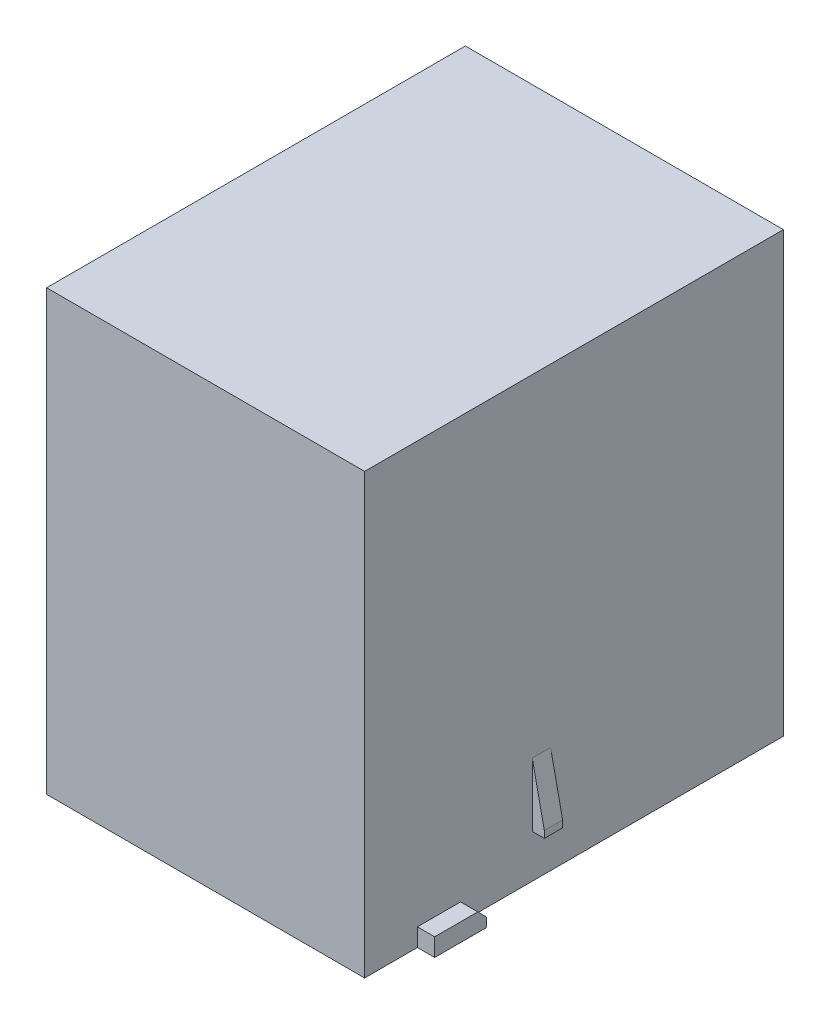
ISO-10303-21;
HEADER;
FILE_DESCRIPTION(('STEP AP214'),'2;1');
FILE_NAME('part.step','',(''),(''),'','','');
FILE_SCHEMA(('AUTOMOTIVE_DESIGN { 1 0 10303 214 1 1 1 1 }'));
ENDSEC;
DATA;
#1=APPLICATION_CONTEXT('core data for automotive mechanical design processes');
#2=APPLICATION_PROTOCOL_DEFINITION('international standard','automotive_design',2000,#1);
#3=PRODUCT_CONTEXT('',#1,'mechanical');
#4=PRODUCT('Part','Part','',(#3));
#5=PRODUCT_RELATED_PRODUCT_CATEGORY('part','',(#4));
#6=PRODUCT_DEFINITION_FORMATION('','',#4);
#7=PRODUCT_DEFINITION_CONTEXT('part definition',#1,'design');
#8=PRODUCT_DEFINITION('design','',#6,#7);
#9=PRODUCT_DEFINITION_SHAPE('','',#8);
#10=(LENGTH_UNIT() NAMED_UNIT(*) SI_UNIT(.MILLI.,.METRE.));
#11=(NAMED_UNIT(*) PLANE_ANGLE_UNIT() SI_UNIT($,.RADIAN.));
#12=(NAMED_UNIT(*) SI_UNIT($,.STERADIAN.) SOLID_ANGLE_UNIT());
#13=UNCERTAINTY_MEASURE_WITH_UNIT(LENGTH_MEASURE(1.E-05),#10,'distance_accuracy_value','');
#14=(GEOMETRIC_REPRESENTATION_CONTEXT(3) GLOBAL_UNCERTAINTY_ASSIGNED_CONTEXT((#13)) GLOBAL_UNIT_ASSIGNED_CONTEXT((#10,
#11,#12)) REPRESENTATION_CONTEXT('',''));
#15=CARTESIAN_POINT('',(0.,0.,0.));
#16=DIRECTION('',(0.,0.,1.));
#17=DIRECTION('',(1.,0.,0.));
#18=AXIS2_PLACEMENT_3D('',#15,#16,#17);
#19=CARTESIAN_POINT('',(-1.0716,0.0906,-6.64));
#20=DIRECTION('',(0.,0.,-1.));
#21=DIRECTION('',(-1.,0.,0.));
#22=AXIS2_PLACEMENT_3D('',#19,#20,#21);
#23=PLANE('',#22);
#24=DIRECTION('',(0.,1.,0.));
#25=VECTOR('',#24,1.);
#26=CARTESIAN_POINT('',(-10.84,0.345,-6.64));
#27=LINE('',#26,#25);
#28=CARTESIAN_POINT('',(-10.84,1.59499999999997,-6.64));
#29=VERTEX_POINT('',#28);
#30=CARTESIAN_POINT('',(-10.84,3.435,-6.64));
#31=VERTEX_POINT('',#30);
#32=EDGE_CURVE('E11',#29,#31,#27,.T.);
#33=ORIENTED_EDGE('',*,*,#32,.F.);
#34=DIRECTION('',(-1.,0.,0.));
#35=VECTOR('',#34,1.);
#36=CARTESIAN_POINT('',(-6.23,1.595,-6.64));
#37=LINE('',#36,#35);
#38=CARTESIAN_POINT('',(-11.1899999999979,1.59499999999995,-6.64000000000016));
#39=VERTEX_POINT('',#38);
#40=EDGE_CURVE('E211',#29,#39,#37,.T.);
#41=ORIENTED_EDGE('',*,*,#40,.T.);
#42=DIRECTION('',(0.,1.,0.));
#43=VECTOR('',#42,1.);
#44=CARTESIAN_POINT('',(-11.19,6.705,-6.64));
#45=LINE('',#44,#43);
#46=CARTESIAN_POINT('',(-11.19,1.795,-6.64));
#47=VERTEX_POINT('',#46);
#48=EDGE_CURVE('E207',#39,#47,#45,.T.);
#49=ORIENTED_EDGE('',*,*,#48,.T.);
#50=DIRECTION('',(0.208714520349179,0.977976609636147,0.));
#51=VECTOR('',#50,1.);
#52=CARTESIAN_POINT('',(-11.19,1.795,-6.64));
#53=LINE('',#52,#51);
#54=EDGE_CURVE('E210',#47,#31,#53,.T.);
#55=ORIENTED_EDGE('',*,*,#54,.T.);
#56=EDGE_LOOP('',(#33,#41,#49,#55));
#57=FACE_BOUND('',#56,.T.);
#58=ADVANCED_FACE('F35',(#57),#23,.T.);
#59=CARTESIAN_POINT('',(-0.9156,0.865,-2.755));
#60=DIRECTION('',(0.,-1.,0.));
#61=DIRECTION('',(-1.,0.,0.));
#62=AXIS2_PLACEMENT_3D('',#59,#60,#61);
#63=PLANE('',#62);
#64=DIRECTION('',(0.,0.,1.));
#65=VECTOR('',#64,1.);
#66=CARTESIAN_POINT('',(-1.12,0.864999999999999,-3.53));
#67=LINE('',#66,#65);
#68=CARTESIAN_POINT('',(-1.12,0.865000000000001,-4.03000000000018));
#69=VERTEX_POINT('',#68);
#70=CARTESIAN_POINT('',(-1.11999999999995,0.865,-2.78));
#71=VERTEX_POINT('',#70);
#72=EDGE_CURVE('E125',#69,#71,#67,.T.);
#73=ORIENTED_EDGE('',*,*,#72,.F.);
#74=DIRECTION('',(1.,0.,0.));
#75=VECTOR('',#74,1.);
#76=CARTESIAN_POINT('',(-1.37,0.865000000000006,-4.03000000000035));
#77=LINE('',#76,#75);
#78=CARTESIAN_POINT('',(-1.62,0.865000000000001,-4.03000000000018));
#79=VERTEX_POINT('',#78);
#80=EDGE_CURVE('E174',#79,#69,#77,.T.);
#81=ORIENTED_EDGE('',*,*,#80,.F.);
#82=DIRECTION('',(0.,0.,-1.));
#83=VECTOR('',#82,1.);
#84=CARTESIAN_POINT('',(-1.62,0.865,-3.945));
#85=LINE('',#84,#83);
#86=CARTESIAN_POINT('',(-1.62000000000009,0.865,-2.78));
#87=VERTEX_POINT('',#86);
#88=EDGE_CURVE('E142',#87,#79,#85,.T.);
#89=ORIENTED_EDGE('',*,*,#88,.F.);
#90=DIRECTION('',(-1.,0.,0.));
#91=VECTOR('',#90,1.);
#92=CARTESIAN_POINT('',(-1.37,0.864999999999999,-2.78));
#93=LINE('',#92,#91);
#94=EDGE_CURVE('E139',#71,#87,#93,.T.);
#95=ORIENTED_EDGE('',*,*,#94,.F.);
#96=EDGE_LOOP('',(#73,#81,#89,#95));
#97=FACE_BOUND('',#96,.T.);
#98=ADVANCED_FACE('F140',(#97),#63,.F.);
#99=CARTESIAN_POINT('',(-1.640665567885,0.8796127631884,-4.015387236812));
#100=DIRECTION('',(0.,0.707106781185535,-0.70710678118756));
#101=DIRECTION('',(1.,0.,0.));
#102=AXIS2_PLACEMENT_3D('',#99,#100,#101);
#103=PLANE('',#102);
#104=DIRECTION('',(1.,0.,0.));
#105=VECTOR('',#104,1.);
#106=CARTESIAN_POINT('',(-1.37,0.614999999999998,-4.28));
#107=LINE('',#106,#105);
#108=CARTESIAN_POINT('',(-1.62,0.615,-4.28));
#109=VERTEX_POINT('',#108);
#110=CARTESIAN_POINT('',(-1.12,0.614999999999992,-4.28));
#111=VERTEX_POINT('',#110);
#112=EDGE_CURVE('E156',#109,#111,#107,.T.);
#113=ORIENTED_EDGE('',*,*,#112,.F.);
#114=DIRECTION('',(0.,-0.707106781186548,-0.707106781186547));
#115=VECTOR('',#114,1.);
#116=CARTESIAN_POINT('',(-1.62,0.865,-4.03));
#117=LINE('',#116,#115);
#118=EDGE_CURVE('E178',#79,#109,#117,.T.);
#119=ORIENTED_EDGE('',*,*,#118,.F.);
#120=ORIENTED_EDGE('',*,*,#80,.T.);
#121=DIRECTION('',(0.,0.707106781186568,0.707106781186527));
#122=VECTOR('',#121,1.);
#123=CARTESIAN_POINT('',(-1.12,0.614999999999986,-4.28));
#124=LINE('',#123,#122);
#125=EDGE_CURVE('E135',#111,#69,#124,.T.);
#126=ORIENTED_EDGE('',*,*,#125,.F.);
#127=EDGE_LOOP('',(#113,#119,#120,#126));
#128=FACE_BOUND('',#127,.T.);
#129=ADVANCED_FACE('F232',(#128),#103,.T.);
#130=CARTESIAN_POINT('',(-1.640665567885,3.4718,-6.11));
#131=DIRECTION('',(0.,0.,-1.));
#132=DIRECTION('',(1.,0.,0.));
#133=AXIS2_PLACEMENT_3D('',#130,#131,#132);
#134=PLANE('',#133);
#135=DIRECTION('',(-1.,0.,0.));
#136=VECTOR('',#135,1.);
#137=CARTESIAN_POINT('',(-1.445,1.595,-6.11));
#138=LINE('',#137,#136);
#139=CARTESIAN_POINT('',(-1.26999999999986,1.59499999999996,-6.10999999999991));
#140=VERTEX_POINT('',#139);
#141=CARTESIAN_POINT('',(-1.62000000000015,1.595,-6.10999999999995));
#142=VERTEX_POINT('',#141);
#143=EDGE_CURVE('E104',#140,#142,#138,.T.);
#144=ORIENTED_EDGE('',*,*,#143,.F.);
#145=DIRECTION('',(0.,-1.,0.));
#146=VECTOR('',#145,1.);
#147=CARTESIAN_POINT('',(-1.26999999999982,2.515,-6.11));
#148=LINE('',#147,#146);
#149=CARTESIAN_POINT('',(-1.26999999999992,1.79499999999968,-6.11));
#150=VERTEX_POINT('',#149);
#151=EDGE_CURVE('E157',#150,#140,#148,.T.);
#152=ORIENTED_EDGE('',*,*,#151,.F.);
#153=DIRECTION('',(0.208714520349178,-0.977976609636147,0.));
#154=VECTOR('',#153,1.);
#155=CARTESIAN_POINT('',(-1.627,3.4678,-6.11));
#156=LINE('',#155,#154);
#157=CARTESIAN_POINT('',(-1.62,3.435,-6.11));
#158=VERTEX_POINT('',#157);
#159=EDGE_CURVE('E39',#158,#150,#156,.T.);
#160=ORIENTED_EDGE('',*,*,#159,.F.);
#161=DIRECTION('',(0.,1.,0.));
#162=VECTOR('',#161,1.);
#163=CARTESIAN_POINT('',(-1.62,6.705,-6.11));
#164=LINE('',#163,#162);
#165=EDGE_CURVE('E158',#142,#158,#164,.T.);
#166=ORIENTED_EDGE('',*,*,#165,.F.);
#167=EDGE_LOOP('',(#144,#152,#160,#166));
#168=FACE_BOUND('',#167,.T.);
#169=ADVANCED_FACE('F484',(#168),#134,.F.);
#170=CARTESIAN_POINT('',(-11.34,0.8856655678848,-2.75));
#171=DIRECTION('',(-1.,0.,0.));
#172=DIRECTION('',(0.,0.,-1.));
#173=AXIS2_PLACEMENT_3D('',#170,#171,#172);
#174=PLANE('',#173);
#175=DIRECTION('',(0.,0.70710678118756,0.707106781185535));
#176=VECTOR('',#175,1.);
#177=CARTESIAN_POINT('',(-11.3399999999956,0.74,-4.155));
#178=LINE('',#177,#176);
#179=CARTESIAN_POINT('',(-11.3399999999967,0.614999999999982,-4.27999999999992));
#180=VERTEX_POINT('',#179);
#181=CARTESIAN_POINT('',(-11.3399999999989,0.865000000000001,-4.03000000000009));
#182=VERTEX_POINT('',#181);
#183=EDGE_CURVE('E185',#180,#182,#178,.T.);
#184=ORIENTED_EDGE('',*,*,#183,.F.);
#185=DIRECTION('',(0.,1.,0.));
#186=VECTOR('',#185,1.);
#187=CARTESIAN_POINT('',(-11.3399999999956,0.48,-4.28));
#188=LINE('',#187,#186);
#189=CARTESIAN_POINT('',(-11.3399999999989,0.344999999999979,-4.28));
#190=VERTEX_POINT('',#189);
#191=EDGE_CURVE('E146',#190,#180,#188,.T.);
#192=ORIENTED_EDGE('',*,*,#191,.F.);
#193=DIRECTION('',(0.,0.,-1.));
#194=VECTOR('',#193,1.);
#195=CARTESIAN_POINT('',(-11.34,0.345,-3.945));
#196=LINE('',#195,#194);
#197=CARTESIAN_POINT('',(-11.3399999999978,0.344999999999978,-2.78));
#198=VERTEX_POINT('',#197);
#199=EDGE_CURVE('E256',#198,#190,#196,.T.);
#200=ORIENTED_EDGE('',*,*,#199,.F.);
#201=DIRECTION('',(0.,-1.,0.));
#202=VECTOR('',#201,1.);
#203=CARTESIAN_POINT('',(-11.3399999999956,0.605,-2.78));
#204=LINE('',#203,#202);
#205=CARTESIAN_POINT('',(-11.3399999999989,0.865,-2.78));
#206=VERTEX_POINT('',#205);
#207=EDGE_CURVE('E274',#206,#198,#204,.T.);
#208=ORIENTED_EDGE('',*,*,#207,.F.);
#209=DIRECTION('',(0.,0.,-1.));
#210=VECTOR('',#209,1.);
#211=CARTESIAN_POINT('',(-11.34,0.865,-3.405));
#212=LINE('',#211,#210);
#213=EDGE_CURVE('E194',#206,#182,#212,.T.);
#214=ORIENTED_EDGE('',*,*,#213,.T.);
#215=EDGE_LOOP('',(#184,#192,#200,#208,#214));
#216=FACE_BOUND('',#215,.T.);
#217=ADVANCED_FACE('F290',(#216),#174,.T.);
#218=CARTESIAN_POINT('',(-1.640665567885,0.6356655678848,-4.28));
#219=DIRECTION('',(0.,0.,-1.));
#220=DIRECTION('',(1.,0.,0.));
#221=AXIS2_PLACEMENT_3D('',#218,#219,#220);
#222=PLANE('',#221);
#223=ORIENTED_EDGE('',*,*,#112,.T.);
#224=DIRECTION('',(0.,1.,0.));
#225=VECTOR('',#224,1.);
#226=CARTESIAN_POINT('',(-1.12,0.605,-4.28));
#227=LINE('',#226,#225);
#228=CARTESIAN_POINT('',(-1.11999999999991,0.344999999999979,-4.28));
#229=VERTEX_POINT('',#228);
#230=EDGE_CURVE('E172',#229,#111,#227,.T.);
#231=ORIENTED_EDGE('',*,*,#230,.F.);
#232=DIRECTION('',(1.,0.,0.));
#233=VECTOR('',#232,1.);
#234=CARTESIAN_POINT('',(-6.23,0.345,-4.28));
#235=LINE('',#234,#233);
#236=CARTESIAN_POINT('',(-1.62000000000005,0.344999999999993,-4.28));
#237=VERTEX_POINT('',#236);
#238=EDGE_CURVE('E237',#237,#229,#235,.T.);
#239=ORIENTED_EDGE('',*,*,#238,.F.);
#240=DIRECTION('',(0.,-1.,0.));
#241=VECTOR('',#240,1.);
#242=CARTESIAN_POINT('',(-1.62,6.705,-4.28));
#243=LINE('',#242,#241);
#244=EDGE_CURVE('E161',#109,#237,#243,.T.);
#245=ORIENTED_EDGE('',*,*,#244,.F.);
#246=EDGE_LOOP('',(#223,#231,#239,#245));
#247=FACE_BOUND('',#246,.T.);
#248=ADVANCED_FACE('F235',(#247),#222,.T.);
#249=CARTESIAN_POINT('',(-1.12,0.8856655678848,-4.31));
#250=DIRECTION('',(1.,0.,0.));
#251=DIRECTION('',(0.,0.,1.));
#252=AXIS2_PLACEMENT_3D('',#249,#250,#251);
#253=PLANE('',#252);
#254=ORIENTED_EDGE('',*,*,#72,.T.);
#255=DIRECTION('',(0.,1.,0.));
#256=VECTOR('',#255,1.);
#257=CARTESIAN_POINT('',(-1.11999999999979,0.605,-2.78));
#258=LINE('',#257,#256);
#259=CARTESIAN_POINT('',(-1.11999999999995,0.344999999999978,-2.78));
#260=VERTEX_POINT('',#259);
#261=EDGE_CURVE('E131',#260,#71,#258,.T.);
#262=ORIENTED_EDGE('',*,*,#261,.F.);
#263=DIRECTION('',(0.,0.,1.));
#264=VECTOR('',#263,1.);
#265=CARTESIAN_POINT('',(-1.12,0.345,-3.945));
#266=LINE('',#265,#264);
#267=EDGE_CURVE('E243',#229,#260,#266,.T.);
#268=ORIENTED_EDGE('',*,*,#267,.F.);
#269=ORIENTED_EDGE('',*,*,#230,.T.);
#270=ORIENTED_EDGE('',*,*,#125,.T.);
#271=EDGE_LOOP('',(#254,#262,#268,#269,#270));
#272=FACE_BOUND('',#271,.T.);
#273=ADVANCED_FACE('F127',(#272),#253,.T.);
#274=CARTESIAN_POINT('',(-1.099334432115,0.8856655678848,-2.78));
#275=DIRECTION('',(0.,0.,1.));
#276=DIRECTION('',(-1.,0.,0.));
#277=AXIS2_PLACEMENT_3D('',#274,#275,#276);
#278=PLANE('',#277);
#279=ORIENTED_EDGE('',*,*,#94,.T.);
#280=DIRECTION('',(0.,1.,0.));
#281=VECTOR('',#280,1.);
#282=CARTESIAN_POINT('',(-1.62,6.705,-2.78));
#283=LINE('',#282,#281);
#284=CARTESIAN_POINT('',(-1.62000000000009,0.344999999999986,-2.78));
#285=VERTEX_POINT('',#284);
#286=EDGE_CURVE('E179',#285,#87,#283,.T.);
#287=ORIENTED_EDGE('',*,*,#286,.F.);
#288=DIRECTION('',(-1.,0.,0.));
#289=VECTOR('',#288,1.);
#290=CARTESIAN_POINT('',(-6.23,0.345,-2.78));
#291=LINE('',#290,#289);
#292=EDGE_CURVE('E150',#260,#285,#291,.T.);
#293=ORIENTED_EDGE('',*,*,#292,.F.);
#294=ORIENTED_EDGE('',*,*,#261,.T.);
#295=EDGE_LOOP('',(#279,#287,#293,#294));
#296=FACE_BOUND('',#295,.T.);
#297=ADVANCED_FACE('F148',(#296),#278,.T.);
#298=CARTESIAN_POINT('',(-11.21066556788,3.4718,-6.11));
#299=DIRECTION('',(0.,0.,-1.));
#300=DIRECTION('',(1.,0.,0.));
#301=AXIS2_PLACEMENT_3D('',#298,#299,#300);
#302=PLANE('',#301);
#303=DIRECTION('',(0.208714520349178,0.977976609636147,0.));
#304=VECTOR('',#303,1.);
#305=CARTESIAN_POINT('',(-11.015,2.615,-6.10999999999982));
#306=LINE('',#305,#304);
#307=CARTESIAN_POINT('',(-11.1899999999979,1.79500000000004,-6.10999999999991));
#308=VERTEX_POINT('',#307);
#309=CARTESIAN_POINT('',(-10.8400000000011,3.43499999999976,-6.10999999999991));
#310=VERTEX_POINT('',#309);
#311=EDGE_CURVE('E206',#308,#310,#306,.T.);
#312=ORIENTED_EDGE('',*,*,#311,.F.);
#313=DIRECTION('',(0.,1.,0.));
#314=VECTOR('',#313,1.);
#315=CARTESIAN_POINT('',(-11.19,1.695,-6.10999999999982));
#316=LINE('',#315,#314);
#317=CARTESIAN_POINT('',(-11.1899999999968,1.59499999999995,-6.10999999999991));
#318=VERTEX_POINT('',#317);
#319=EDGE_CURVE('E349',#318,#308,#316,.T.);
#320=ORIENTED_EDGE('',*,*,#319,.F.);
#321=DIRECTION('',(-1.,0.,0.));
#322=VECTOR('',#321,1.);
#323=CARTESIAN_POINT('',(-11.015,1.595,-6.10999999999982));
#324=LINE('',#323,#322);
#325=CARTESIAN_POINT('',(-10.8400000000032,1.595,-6.10999999999995));
#326=VERTEX_POINT('',#325);
#327=EDGE_CURVE('E351',#326,#318,#324,.T.);
#328=ORIENTED_EDGE('',*,*,#327,.F.);
#329=DIRECTION('',(0.,-1.,0.));
#330=VECTOR('',#329,1.);
#331=CARTESIAN_POINT('',(-10.84,6.705,-6.11));
#332=LINE('',#331,#330);
#333=EDGE_CURVE('E214',#310,#326,#332,.T.);
#334=ORIENTED_EDGE('',*,*,#333,.F.);
#335=EDGE_LOOP('',(#312,#320,#328,#334));
#336=FACE_BOUND('',#335,.T.);
#337=ADVANCED_FACE('F472',(#336),#302,.F.);
#338=CARTESIAN_POINT('',(-11.36066556788,0.6356655678848,-4.28));
#339=DIRECTION('',(0.,0.,-1.));
#340=DIRECTION('',(1.,0.,0.));
#341=AXIS2_PLACEMENT_3D('',#338,#339,#340);
#342=PLANE('',#341);
#343=DIRECTION('',(-1.,0.,0.));
#344=VECTOR('',#343,1.);
#345=CARTESIAN_POINT('',(-11.09,0.614999999999945,-4.2799999999997));
#346=LINE('',#345,#344);
#347=CARTESIAN_POINT('',(-10.84,0.615000000000017,-4.27999999999989));
#348=VERTEX_POINT('',#347);
#349=EDGE_CURVE('E182',#348,#180,#346,.T.);
#350=ORIENTED_EDGE('',*,*,#349,.F.);
#351=DIRECTION('',(0.,1.,0.));
#352=VECTOR('',#351,1.);
#353=CARTESIAN_POINT('',(-10.84,6.705,-4.28));
#354=LINE('',#353,#352);
#355=CARTESIAN_POINT('',(-10.8400000000011,0.344999999999993,-4.28));
#356=VERTEX_POINT('',#355);
#357=EDGE_CURVE('E186',#356,#348,#354,.T.);
#358=ORIENTED_EDGE('',*,*,#357,.F.);
#359=DIRECTION('',(1.,0.,0.));
#360=VECTOR('',#359,1.);
#361=CARTESIAN_POINT('',(-6.23,0.345,-4.28));
#362=LINE('',#361,#360);
#363=EDGE_CURVE('E253',#190,#356,#362,.T.);
#364=ORIENTED_EDGE('',*,*,#363,.F.);
#365=ORIENTED_EDGE('',*,*,#191,.T.);
#366=EDGE_LOOP('',(#350,#358,#364,#365));
#367=FACE_BOUND('',#366,.T.);
#368=ADVANCED_FACE('F285',(#367),#342,.T.);
#369=CARTESIAN_POINT('',(-11.36066556788,0.8796127631884,-4.015387236812));
#370=DIRECTION('',(0.,0.707106781185535,-0.70710678118756));
#371=DIRECTION('',(1.,0.,0.));
#372=AXIS2_PLACEMENT_3D('',#369,#370,#371);
#373=PLANE('',#372);
#374=ORIENTED_EDGE('',*,*,#349,.T.);
#375=ORIENTED_EDGE('',*,*,#183,.T.);
#376=DIRECTION('',(1.,0.,0.));
#377=VECTOR('',#376,1.);
#378=CARTESIAN_POINT('',(-6.23,0.865,-4.03));
#379=LINE('',#378,#377);
#380=CARTESIAN_POINT('',(-10.84,0.865,-4.03));
#381=VERTEX_POINT('',#380);
#382=EDGE_CURVE('E191',#182,#381,#379,.T.);
#383=ORIENTED_EDGE('',*,*,#382,.T.);
#384=DIRECTION('',(0.,0.707106781186548,0.707106781186547));
#385=VECTOR('',#384,1.);
#386=CARTESIAN_POINT('',(-10.84,0.615,-4.28));
#387=LINE('',#386,#385);
#388=EDGE_CURVE('E189',#348,#381,#387,.T.);
#389=ORIENTED_EDGE('',*,*,#388,.F.);
#390=EDGE_LOOP('',(#374,#375,#383,#389));
#391=FACE_BOUND('',#390,.T.);
#392=ADVANCED_FACE('F294',(#391),#373,.T.);
#393=CARTESIAN_POINT('',(-0.9156,0.865,-2.755));
#394=DIRECTION('',(0.,-1.,0.));
#395=DIRECTION('',(-1.,0.,0.));
#396=AXIS2_PLACEMENT_3D('',#393,#394,#395);
#397=PLANE('',#396);
#398=ORIENTED_EDGE('',*,*,#213,.F.);
#399=DIRECTION('',(-1.,0.,0.));
#400=VECTOR('',#399,1.);
#401=CARTESIAN_POINT('',(-11.09,0.864999999999999,-2.78));
#402=LINE('',#401,#400);
#403=CARTESIAN_POINT('',(-10.8400000000011,0.865,-2.78));
#404=VERTEX_POINT('',#403);
#405=EDGE_CURVE('E193',#404,#206,#402,.T.);
#406=ORIENTED_EDGE('',*,*,#405,.F.);
#407=DIRECTION('',(0.,0.,1.));
#408=VECTOR('',#407,1.);
#409=CARTESIAN_POINT('',(-10.84,0.865,-3.945));
#410=LINE('',#409,#408);
#411=EDGE_CURVE('E195',#381,#404,#410,.T.);
#412=ORIENTED_EDGE('',*,*,#411,.F.);
#413=ORIENTED_EDGE('',*,*,#382,.F.);
#414=EDGE_LOOP('',(#398,#406,#412,#413));
#415=FACE_BOUND('',#414,.T.);
#416=ADVANCED_FACE('F464',(#415),#397,.F.);
#417=CARTESIAN_POINT('',(-10.81933443212,0.8856655678848,-2.78));
#418=DIRECTION('',(0.,0.,1.));
#419=DIRECTION('',(-1.,0.,0.));
#420=AXIS2_PLACEMENT_3D('',#417,#418,#419);
#421=PLANE('',#420);
#422=ORIENTED_EDGE('',*,*,#405,.T.);
#423=ORIENTED_EDGE('',*,*,#207,.T.);
#424=DIRECTION('',(-1.,0.,0.));
#425=VECTOR('',#424,1.);
#426=CARTESIAN_POINT('',(-6.23,0.345,-2.78));
#427=LINE('',#426,#425);
#428=CARTESIAN_POINT('',(-10.8400000000022,0.344999999999986,-2.78));
#429=VERTEX_POINT('',#428);
#430=EDGE_CURVE('E262',#429,#198,#427,.T.);
#431=ORIENTED_EDGE('',*,*,#430,.F.);
#432=DIRECTION('',(0.,-1.,0.));
#433=VECTOR('',#432,1.);
#434=CARTESIAN_POINT('',(-10.84,6.705,-2.78));
#435=LINE('',#434,#433);
#436=EDGE_CURVE('E198',#404,#429,#435,.T.);
#437=ORIENTED_EDGE('',*,*,#436,.F.);
#438=EDGE_LOOP('',(#422,#423,#431,#437));
#439=FACE_BOUND('',#438,.T.);
#440=ADVANCED_FACE('F323',(#439),#421,.T.);
#441=CARTESIAN_POINT('',(-1.4356,13.3194,-1.25));
#442=DIRECTION('',(0.,0.,1.));
#443=DIRECTION('',(-1.,0.,0.));
#444=AXIS2_PLACEMENT_3D('',#441,#442,#443);
#445=PLANE('',#444);
#446=DIRECTION('',(1.,0.,0.));
#447=VECTOR('',#446,1.);
#448=CARTESIAN_POINT('',(-6.23,13.065,-1.25));
#449=LINE('',#448,#447);
#450=CARTESIAN_POINT('',(-10.84,13.065,-1.25));
#451=VERTEX_POINT('',#450);
#452=CARTESIAN_POINT('',(-1.62,13.065,-1.25));
#453=VERTEX_POINT('',#452);
#454=EDGE_CURVE('E364',#451,#453,#449,.T.);
#455=ORIENTED_EDGE('',*,*,#454,.F.);
#456=DIRECTION('',(0.,1.,0.));
#457=VECTOR('',#456,1.);
#458=CARTESIAN_POINT('',(-10.84,6.705,-1.25));
#459=LINE('',#458,#457);
#460=CARTESIAN_POINT('',(-10.84,0.345,-1.25));
#461=VERTEX_POINT('',#460);
#462=EDGE_CURVE('E334',#461,#451,#459,.T.);
#463=ORIENTED_EDGE('',*,*,#462,.F.);
#464=DIRECTION('',(-1.,0.,0.));
#465=VECTOR('',#464,1.);
#466=CARTESIAN_POINT('',(-6.23,0.345,-1.25));
#467=LINE('',#466,#465);
#468=CARTESIAN_POINT('',(-1.62,0.345,-1.25));
#469=VERTEX_POINT('',#468);
#470=EDGE_CURVE('E265',#469,#461,#467,.T.);
#471=ORIENTED_EDGE('',*,*,#470,.F.);
#472=DIRECTION('',(0.,-1.,0.));
#473=VECTOR('',#472,1.);
#474=CARTESIAN_POINT('',(-1.62,6.705,-1.25));
#475=LINE('',#474,#473);
#476=EDGE_CURVE('E160',#453,#469,#475,.T.);
#477=ORIENTED_EDGE('',*,*,#476,.F.);
#478=EDGE_LOOP('',(#455,#463,#471,#477));
#479=FACE_BOUND('',#478,.T.);
#480=ADVANCED_FACE('F362',(#479),#445,.T.);
#481=CARTESIAN_POINT('',(-1.62,0.0906,-1.1422));
#482=DIRECTION('',(1.,0.,0.));
#483=DIRECTION('',(0.,0.,-1.));
#484=AXIS2_PLACEMENT_3D('',#481,#482,#483);
#485=PLANE('',#484);
#486=DIRECTION('',(0.,0.,1.));
#487=VECTOR('',#486,1.);
#488=CARTESIAN_POINT('',(-1.62,3.435,-6.375));
#489=LINE('',#488,#487);
#490=CARTESIAN_POINT('',(-1.62,3.435,-6.64));
#491=VERTEX_POINT('',#490);
#492=EDGE_CURVE('E162',#491,#158,#489,.T.);
#493=ORIENTED_EDGE('',*,*,#492,.F.);
#494=DIRECTION('',(0.,-1.,0.));
#495=VECTOR('',#494,1.);
#496=CARTESIAN_POINT('',(-1.62,13.065,-6.64));
#497=LINE('',#496,#495);
#498=CARTESIAN_POINT('',(-1.62000000000004,1.595,-6.64000000000005));
#499=VERTEX_POINT('',#498);
#500=EDGE_CURVE('E45',#491,#499,#497,.T.);
#501=ORIENTED_EDGE('',*,*,#500,.T.);
#502=DIRECTION('',(0.,0.,-1.));
#503=VECTOR('',#502,1.);
#504=CARTESIAN_POINT('',(-1.62000000000018,1.595,-6.375));
#505=LINE('',#504,#503);
#506=EDGE_CURVE('E168',#142,#499,#505,.T.);
#507=ORIENTED_EDGE('',*,*,#506,.F.);
#508=ORIENTED_EDGE('',*,*,#165,.T.);
#509=EDGE_LOOP('',(#493,#501,#507,#508));
#510=FACE_BOUND('',#509,.T.);
#511=DIRECTION('',(0.,0.,-1.));
#512=VECTOR('',#511,1.);
#513=CARTESIAN_POINT('',(-1.62,13.065,-3.945));
#514=LINE('',#513,#512);
#515=CARTESIAN_POINT('',(-1.62,13.065,-13.39));
#516=VERTEX_POINT('',#515);
#517=EDGE_CURVE('E219',#453,#516,#514,.T.);
#518=ORIENTED_EDGE('',*,*,#517,.F.);
#519=ORIENTED_EDGE('',*,*,#476,.T.);
#520=DIRECTION('',(0.,0.,1.));
#521=VECTOR('',#520,1.);
#522=CARTESIAN_POINT('',(-1.62,0.345,-3.945));
#523=LINE('',#522,#521);
#524=EDGE_CURVE('E354',#285,#469,#523,.T.);
#525=ORIENTED_EDGE('',*,*,#524,.F.);
#526=ORIENTED_EDGE('',*,*,#286,.T.);
#527=ORIENTED_EDGE('',*,*,#88,.T.);
#528=ORIENTED_EDGE('',*,*,#118,.T.);
#529=ORIENTED_EDGE('',*,*,#244,.T.);
#530=DIRECTION('',(0.,0.,1.));
#531=VECTOR('',#530,1.);
#532=CARTESIAN_POINT('',(-1.62,0.345,-3.945));
#533=LINE('',#532,#531);
#534=CARTESIAN_POINT('',(-1.62,0.345,-13.39));
#535=VERTEX_POINT('',#534);
#536=EDGE_CURVE('E244',#535,#237,#533,.T.);
#537=ORIENTED_EDGE('',*,*,#536,.F.);
#538=DIRECTION('',(0.,-1.,0.));
#539=VECTOR('',#538,1.);
#540=CARTESIAN_POINT('',(-1.62,13.065,-13.39));
#541=LINE('',#540,#539);
#542=EDGE_CURVE('E398',#516,#535,#541,.T.);
#543=ORIENTED_EDGE('',*,*,#542,.F.);
#544=EDGE_LOOP('',(#518,#519,#525,#526,#527,#528,#529,#537,#543));
#545=FACE_BOUND('',#544,.T.);
#546=ADVANCED_FACE('F226',(#510,#545),#485,.T.);
#547=CARTESIAN_POINT('',(-1.627,3.4678,-6.089334432115));
#548=DIRECTION('',(0.977976609636147,0.208714520349178,0.));
#549=DIRECTION('',(0.208714520349178,-0.977976609636147,0.));
#550=AXIS2_PLACEMENT_3D('',#547,#548,#549);
#551=PLANE('',#550);
#552=DIRECTION('',(0.208714520349178,-0.977976609636147,0.));
#553=VECTOR('',#552,1.);
#554=CARTESIAN_POINT('',(-1.62,3.435,-6.64));
#555=LINE('',#554,#553);
#556=CARTESIAN_POINT('',(-1.27,1.7950000000001,-6.64));
#557=VERTEX_POINT('',#556);
#558=EDGE_CURVE('E203',#491,#557,#555,.T.);
#559=ORIENTED_EDGE('',*,*,#558,.F.);
#560=ORIENTED_EDGE('',*,*,#492,.T.);
#561=ORIENTED_EDGE('',*,*,#159,.T.);
#562=DIRECTION('',(0.,0.,1.));
#563=VECTOR('',#562,1.);
#564=CARTESIAN_POINT('',(-1.27,1.79500000000019,-6.375));
#565=LINE('',#564,#563);
#566=EDGE_CURVE('E165',#557,#150,#565,.T.);
#567=ORIENTED_EDGE('',*,*,#566,.F.);
#568=EDGE_LOOP('',(#559,#560,#561,#567));
#569=FACE_BOUND('',#568,.T.);
#570=ADVANCED_FACE('F452',(#569),#551,.T.);
#571=CARTESIAN_POINT('',(-1.27,1.815665567885,-6.089334432115));
#572=DIRECTION('',(1.,0.,0.));
#573=DIRECTION('',(0.,-1.,0.));
#574=AXIS2_PLACEMENT_3D('',#571,#572,#573);
#575=PLANE('',#574);
#576=DIRECTION('',(0.,-1.,0.));
#577=VECTOR('',#576,1.);
#578=CARTESIAN_POINT('',(-1.27,6.705,-6.64));
#579=LINE('',#578,#577);
#580=CARTESIAN_POINT('',(-1.26999999999995,1.59499999999992,-6.64000000000016));
#581=VERTEX_POINT('',#580);
#582=EDGE_CURVE('E199',#557,#581,#579,.T.);
#583=ORIENTED_EDGE('',*,*,#582,.F.);
#584=ORIENTED_EDGE('',*,*,#566,.T.);
#585=ORIENTED_EDGE('',*,*,#151,.T.);
#586=DIRECTION('',(0.,0.,1.));
#587=VECTOR('',#586,1.);
#588=CARTESIAN_POINT('',(-1.26999999999979,1.595,-6.375));
#589=LINE('',#588,#587);
#590=EDGE_CURVE('E268',#581,#140,#589,.T.);
#591=ORIENTED_EDGE('',*,*,#590,.F.);
#592=EDGE_LOOP('',(#583,#584,#585,#591));
#593=FACE_BOUND('',#592,.T.);
#594=ADVANCED_FACE('F449',(#593),#575,.T.);
#595=CARTESIAN_POINT('',(-1.249334432115,1.595,-6.089334432115));
#596=DIRECTION('',(0.,-1.,0.));
#597=DIRECTION('',(-1.,0.,0.));
#598=AXIS2_PLACEMENT_3D('',#595,#596,#597);
#599=PLANE('',#598);
#600=DIRECTION('',(-1.,0.,0.));
#601=VECTOR('',#600,1.);
#602=CARTESIAN_POINT('',(-6.23,1.595,-6.64));
#603=LINE('',#602,#601);
#604=EDGE_CURVE('E202',#581,#499,#603,.T.);
#605=ORIENTED_EDGE('',*,*,#604,.F.);
#606=ORIENTED_EDGE('',*,*,#590,.T.);
#607=ORIENTED_EDGE('',*,*,#143,.T.);
#608=ORIENTED_EDGE('',*,*,#506,.T.);
#609=EDGE_LOOP('',(#605,#606,#607,#608));
#610=FACE_BOUND('',#609,.T.);
#611=ADVANCED_FACE('F446',(#610),#599,.T.);
#612=CARTESIAN_POINT('',(-0.9156,0.345,-6.7478));
#613=DIRECTION('',(0.,-1.,0.));
#614=DIRECTION('',(0.,0.,1.));
#615=AXIS2_PLACEMENT_3D('',#612,#613,#614);
#616=PLANE('',#615);
#617=ORIENTED_EDGE('',*,*,#292,.T.);
#618=ORIENTED_EDGE('',*,*,#524,.T.);
#619=ORIENTED_EDGE('',*,*,#470,.T.);
#620=DIRECTION('',(0.,0.,1.));
#621=VECTOR('',#620,1.);
#622=CARTESIAN_POINT('',(-10.84,0.345,-3.945));
#623=LINE('',#622,#621);
#624=EDGE_CURVE('E329',#429,#461,#623,.T.);
#625=ORIENTED_EDGE('',*,*,#624,.F.);
#626=ORIENTED_EDGE('',*,*,#430,.T.);
#627=ORIENTED_EDGE('',*,*,#199,.T.);
#628=ORIENTED_EDGE('',*,*,#363,.T.);
#629=DIRECTION('',(0.,0.,1.));
#630=VECTOR('',#629,1.);
#631=CARTESIAN_POINT('',(-10.84,0.345,-3.945));
#632=LINE('',#631,#630);
#633=CARTESIAN_POINT('',(-10.84,0.345,-13.39));
#634=VERTEX_POINT('',#633);
#635=EDGE_CURVE('E190',#634,#356,#632,.T.);
#636=ORIENTED_EDGE('',*,*,#635,.F.);
#637=DIRECTION('',(-1.,0.,0.));
#638=VECTOR('',#637,1.);
#639=CARTESIAN_POINT('',(-1.62,0.345,-13.39));
#640=LINE('',#639,#638);
#641=EDGE_CURVE('E175',#535,#634,#640,.T.);
#642=ORIENTED_EDGE('',*,*,#641,.F.);
#643=ORIENTED_EDGE('',*,*,#536,.T.);
#644=ORIENTED_EDGE('',*,*,#238,.T.);
#645=ORIENTED_EDGE('',*,*,#267,.T.);
#646=EDGE_LOOP('',(#617,#618,#619,#625,#626,#627,#628,#636,#642,#643,#644,#645));
#647=FACE_BOUND('',#646,.T.);
#648=ADVANCED_FACE('F247',(#647),#616,.T.);
#649=CARTESIAN_POINT('',(-10.81933443212,1.595,-6.089334432115));
#650=DIRECTION('',(0.,-1.,0.));
#651=DIRECTION('',(-1.,0.,0.));
#652=AXIS2_PLACEMENT_3D('',#649,#650,#651);
#653=PLANE('',#652);
#654=ORIENTED_EDGE('',*,*,#40,.F.);
#655=DIRECTION('',(0.,0.,-1.));
#656=VECTOR('',#655,1.);
#657=CARTESIAN_POINT('',(-10.84,1.595,-3.945));
#658=LINE('',#657,#656);
#659=EDGE_CURVE('E340',#326,#29,#658,.T.);
#660=ORIENTED_EDGE('',*,*,#659,.F.);
#661=ORIENTED_EDGE('',*,*,#327,.T.);
#662=DIRECTION('',(0.,0.,1.));
#663=VECTOR('',#662,1.);
#664=CARTESIAN_POINT('',(-11.19,1.59499999999981,-6.375));
#665=LINE('',#664,#663);
#666=EDGE_CURVE('E346',#39,#318,#665,.T.);
#667=ORIENTED_EDGE('',*,*,#666,.F.);
#668=EDGE_LOOP('',(#654,#660,#661,#667));
#669=FACE_BOUND('',#668,.T.);
#670=ADVANCED_FACE('F432',(#669),#653,.T.);
#671=CARTESIAN_POINT('',(-11.19,1.574334432115,-6.089334432115));
#672=DIRECTION('',(-1.,0.,0.));
#673=DIRECTION('',(0.,1.,0.));
#674=AXIS2_PLACEMENT_3D('',#671,#672,#673);
#675=PLANE('',#674);
#676=ORIENTED_EDGE('',*,*,#48,.F.);
#677=ORIENTED_EDGE('',*,*,#666,.T.);
#678=ORIENTED_EDGE('',*,*,#319,.T.);
#679=DIRECTION('',(0.,0.,1.));
#680=VECTOR('',#679,1.);
#681=CARTESIAN_POINT('',(-11.19,1.795,-6.375));
#682=LINE('',#681,#680);
#683=EDGE_CURVE('E54',#47,#308,#682,.T.);
#684=ORIENTED_EDGE('',*,*,#683,.F.);
#685=EDGE_LOOP('',(#676,#677,#678,#684));
#686=FACE_BOUND('',#685,.T.);
#687=ADVANCED_FACE('F433',(#686),#675,.T.);
#688=CARTESIAN_POINT('',(-11.197,1.7622,-6.089334432115));
#689=DIRECTION('',(-0.977976609636147,0.208714520349178,0.));
#690=DIRECTION('',(0.208714520349178,0.977976609636147,0.));
#691=AXIS2_PLACEMENT_3D('',#688,#689,#690);
#692=PLANE('',#691);
#693=ORIENTED_EDGE('',*,*,#54,.F.);
#694=ORIENTED_EDGE('',*,*,#683,.T.);
#695=ORIENTED_EDGE('',*,*,#311,.T.);
#696=DIRECTION('',(0.,0.,1.));
#697=VECTOR('',#696,1.);
#698=CARTESIAN_POINT('',(-10.84,3.435,-3.945));
#699=LINE('',#698,#697);
#700=EDGE_CURVE('E205',#31,#310,#699,.T.);
#701=ORIENTED_EDGE('',*,*,#700,.F.);
#702=EDGE_LOOP('',(#693,#694,#695,#701));
#703=FACE_BOUND('',#702,.T.);
#704=ADVANCED_FACE('F418',(#703),#692,.T.);
#705=CARTESIAN_POINT('',(-10.84,0.0906,-6.7478));
#706=DIRECTION('',(-1.,0.,0.));
#707=DIRECTION('',(0.,0.,1.));
#708=AXIS2_PLACEMENT_3D('',#705,#706,#707);
#709=PLANE('',#708);
#710=ORIENTED_EDGE('',*,*,#659,.T.);
#711=ORIENTED_EDGE('',*,*,#32,.T.);
#712=ORIENTED_EDGE('',*,*,#700,.T.);
#713=ORIENTED_EDGE('',*,*,#333,.T.);
#714=EDGE_LOOP('',(#710,#711,#712,#713));
#715=FACE_BOUND('',#714,.T.);
#716=ORIENTED_EDGE('',*,*,#462,.T.);
#717=DIRECTION('',(0.,0.,1.));
#718=VECTOR('',#717,1.);
#719=CARTESIAN_POINT('',(-10.84,13.065,-3.945));
#720=LINE('',#719,#718);
#721=CARTESIAN_POINT('',(-10.84,13.065,-13.39));
#722=VERTEX_POINT('',#721);
#723=EDGE_CURVE('E391',#722,#451,#720,.T.);
#724=ORIENTED_EDGE('',*,*,#723,.F.);
#725=DIRECTION('',(0.,1.,0.));
#726=VECTOR('',#725,1.);
#727=CARTESIAN_POINT('',(-10.84,0.345,-13.39));
#728=LINE('',#727,#726);
#729=EDGE_CURVE('E390',#634,#722,#728,.T.);
#730=ORIENTED_EDGE('',*,*,#729,.F.);
#731=ORIENTED_EDGE('',*,*,#635,.T.);
#732=ORIENTED_EDGE('',*,*,#357,.T.);
#733=ORIENTED_EDGE('',*,*,#388,.T.);
#734=ORIENTED_EDGE('',*,*,#411,.T.);
#735=ORIENTED_EDGE('',*,*,#436,.T.);
#736=ORIENTED_EDGE('',*,*,#624,.T.);
#737=EDGE_LOOP('',(#716,#724,#730,#731,#732,#733,#734,#735,#736));
#738=FACE_BOUND('',#737,.T.);
#739=ADVANCED_FACE('F299',(#715,#738),#709,.T.);
#740=CARTESIAN_POINT('',(-11.0244,13.065,-1.1422));
#741=DIRECTION('',(0.,1.,0.));
#742=DIRECTION('',(1.,0.,0.));
#743=AXIS2_PLACEMENT_3D('',#740,#741,#742);
#744=PLANE('',#743);
#745=ORIENTED_EDGE('',*,*,#454,.T.);
#746=ORIENTED_EDGE('',*,*,#517,.T.);
#747=DIRECTION('',(1.,0.,0.));
#748=VECTOR('',#747,1.);
#749=CARTESIAN_POINT('',(-10.84,13.065,-13.39));
#750=LINE('',#749,#748);
#751=EDGE_CURVE('E395',#722,#516,#750,.T.);
#752=ORIENTED_EDGE('',*,*,#751,.F.);
#753=ORIENTED_EDGE('',*,*,#723,.T.);
#754=EDGE_LOOP('',(#745,#746,#752,#753));
#755=FACE_BOUND('',#754,.T.);
#756=ADVANCED_FACE('F411',(#755),#744,.T.);
#757=ORIENTED_EDGE('',*,*,#500,.F.);
#758=ORIENTED_EDGE('',*,*,#558,.T.);
#759=ORIENTED_EDGE('',*,*,#582,.T.);
#760=ORIENTED_EDGE('',*,*,#604,.T.);
#761=EDGE_LOOP('',(#757,#758,#759,#760));
#762=FACE_BOUND('',#761,.T.);
#763=ADVANCED_FACE('F37',(#762),#23,.T.);
#764=CARTESIAN_POINT('',(-0.5,14.635,-13.39));
#765=DIRECTION('',(0.,0.,-1.));
#766=DIRECTION('',(-1.,0.,0.));
#767=AXIS2_PLACEMENT_3D('',#764,#765,#766);
#768=PLANE('',#767);
#769=ORIENTED_EDGE('',*,*,#729,.T.);
#770=ORIENTED_EDGE('',*,*,#751,.T.);
#771=ORIENTED_EDGE('',*,*,#542,.T.);
#772=ORIENTED_EDGE('',*,*,#641,.T.);
#773=EDGE_LOOP('',(#769,#770,#771,#772));
#774=FACE_BOUND('',#773,.T.);
#775=ADVANCED_FACE('F397',(#774),#768,.T.);
#776=CLOSED_SHELL('',(#58,#98,#129,#169,#217,#248,#273,#297,#337,#368,#392,#416,#440,#480,#546,
#570,#594,#611,#648,#670,#687,#704,#739,#756,#763,#775));
#777=MANIFOLD_SOLID_BREP('B2',#776);
#778=ADVANCED_BREP_SHAPE_REPRESENTATION('',(#18,#777),#14);
#779=SHAPE_DEFINITION_REPRESENTATION(#9,#778);
ENDSEC;
END-ISO-10303-21;
